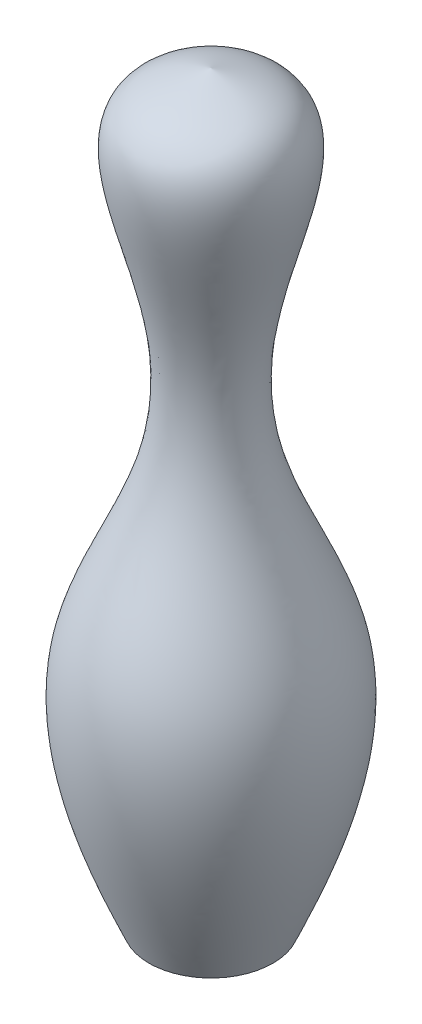
ISO-10303-21;
HEADER;
FILE_DESCRIPTION(('STEP AP214'),'2;1');
FILE_NAME('part.step','',(''),(''),'','','');
FILE_SCHEMA(('AUTOMOTIVE_DESIGN { 1 0 10303 214 1 1 1 1 }'));
ENDSEC;
DATA;
#1=APPLICATION_CONTEXT('core data for automotive mechanical design processes');
#2=APPLICATION_PROTOCOL_DEFINITION('international standard','automotive_design',2000,#1);
#3=PRODUCT_CONTEXT('',#1,'mechanical');
#4=PRODUCT('Part','Part','',(#3));
#5=PRODUCT_RELATED_PRODUCT_CATEGORY('part','',(#4));
#6=PRODUCT_DEFINITION_FORMATION('','',#4);
#7=PRODUCT_DEFINITION_CONTEXT('part definition',#1,'design');
#8=PRODUCT_DEFINITION('design','',#6,#7);
#9=PRODUCT_DEFINITION_SHAPE('','',#8);
#10=(LENGTH_UNIT() NAMED_UNIT(*) SI_UNIT(.MILLI.,.METRE.));
#11=(NAMED_UNIT(*) PLANE_ANGLE_UNIT() SI_UNIT($,.RADIAN.));
#12=(NAMED_UNIT(*) SI_UNIT($,.STERADIAN.) SOLID_ANGLE_UNIT());
#13=UNCERTAINTY_MEASURE_WITH_UNIT(LENGTH_MEASURE(1.E-05),#10,'distance_accuracy_value','');
#14=(GEOMETRIC_REPRESENTATION_CONTEXT(3) GLOBAL_UNCERTAINTY_ASSIGNED_CONTEXT((#13)) GLOBAL_UNIT_ASSIGNED_CONTEXT((#10,
#11,#12)) REPRESENTATION_CONTEXT('',''));
#15=CARTESIAN_POINT('',(0.,0.,0.));
#16=DIRECTION('',(0.,0.,1.));
#17=DIRECTION('',(1.,0.,0.));
#18=AXIS2_PLACEMENT_3D('',#15,#16,#17);
#19=CARTESIAN_POINT('',(0.,0.,0.));
#20=DIRECTION('',(0.,1.,0.));
#21=DIRECTION('',(0.,0.,1.));
#22=AXIS2_PLACEMENT_3D('',#19,#20,#21);
#23=PLANE('',#22);
#24=CARTESIAN_POINT('',(0.,0.,0.));
#25=DIRECTION('',(0.,1.,0.));
#26=DIRECTION('',(0.,0.,1.));
#27=AXIS2_PLACEMENT_3D('',#24,#25,#26);
#28=CIRCLE('',#27,31.75);
#29=CARTESIAN_POINT('',(0.,0.,31.75));
#30=VERTEX_POINT('',#29);
#31=EDGE_CURVE('E12',#30,#30,#28,.T.);
#32=ORIENTED_EDGE('',*,*,#31,.F.);
#33=EDGE_LOOP('',(#32));
#34=FACE_BOUND('',#33,.T.);
#35=ADVANCED_FACE('F78',(#34),#23,.F.);
#36=CARTESIAN_POINT('',(3.16663542822949,0.,31.5916906806945));
#37=CARTESIAN_POINT('',(9.499769656982,42.9725274749654,49.9112858692772));
#38=CARTESIAN_POINT('',(19.2342785375199,132.2861154209,79.310308211931));
#39=CARTESIAN_POINT('',(-22.3027870591613,237.017821482715,-12.1181370112404));
#40=CARTESIAN_POINT('',(7.87553133322772,363.116845883692,65.4313444200855));
#41=CARTESIAN_POINT('',(1.46471732391017,377.67403194375,12.1691375024412));
#42=CARTESIAN_POINT('',(0.,381.,0.));
#43=CARTESIAN_POINT('',(5.23430662300992,0.,31.3844348891163));
#44=CARTESIAN_POINT('',(12.7664717244933,42.9725290000868,49.2895386438164));
#45=CARTESIAN_POINT('',(24.4251179301998,132.286114686026,78.0514223016016));
#46=CARTESIAN_POINT('',(-23.0959153492308,237.01782165872,-10.6584218066882));
#47=CARTESIAN_POINT('',(12.1580024459148,363.11684587373,64.9158920576719));
#48=CARTESIAN_POINT('',(2.26118544301125,377.674031941897,12.0732719699542));
#49=CARTESIAN_POINT('',(0.,381.,0.));
#50=CARTESIAN_POINT('',(9.32877665451283,0.,30.5627585130787));
#51=CARTESIAN_POINT('',(19.1773080510315,42.9725748475129,47.4029210954109));
#52=CARTESIAN_POINT('',(34.5588287267523,132.286092594605,74.5120219898257));
#53=CARTESIAN_POINT('',(-24.3947382156472,237.017826949692,-7.58491738639315));
#54=CARTESIAN_POINT('',(20.621320492197,363.116845574249,63.0418048039179));
#55=CARTESIAN_POINT('',(3.83522128080285,377.674031886199,11.7247230338956));
#56=CARTESIAN_POINT('',(0.,381.,0.));
#57=CARTESIAN_POINT('',(15.1120324711538,0.,28.155462156039));
#58=CARTESIAN_POINT('',(28.0566295643723,42.9724692718067,42.7501575139924));
#59=CARTESIAN_POINT('',(48.4311865893113,132.286143465887,66.3366163325763));
#60=CARTESIAN_POINT('',(-25.4051912104954,237.017814765845,-2.6746148175494));
#61=CARTESIAN_POINT('',(32.5239168152912,363.116846263884,57.8069700966195));
#62=CARTESIAN_POINT('',(6.0489054496906,377.674032014459,10.7511311885764));
#63=CARTESIAN_POINT('',(0.,381.,0.));
#64=CARTESIAN_POINT('',(20.314514289368,0.,24.6662908521901));
#65=CARTESIAN_POINT('',(35.8577806122383,42.9726022190068,36.4558989965607));
#66=CARTESIAN_POINT('',(60.4425680764867,132.286079405747,55.6155313175213));
#67=CARTESIAN_POINT('',(-25.4401079303351,237.017830108468,2.32566857633943));
#68=CARTESIAN_POINT('',(43.1766258921574,363.116845395454,50.3516242522325));
#69=CARTESIAN_POINT('',(8.03013146115085,377.674031852946,9.36456134941616));
#70=CARTESIAN_POINT('',(0.,381.,0.));
#71=CARTESIAN_POINT('',(24.7363643778042,0.,20.2291323307413));
#72=CARTESIAN_POINT('',(42.2807604634572,42.9724602906549,28.7591418920904));
#73=CARTESIAN_POINT('',(70.1305610270316,132.286147793423,42.7530849447898));
#74=CARTESIAN_POINT('',(-24.4950311981438,237.017813729385,7.25197740091281));
#75=CARTESIAN_POINT('',(52.1700379600744,363.116846322549,40.9602671532404));
#76=CARTESIAN_POINT('',(9.70275593556101,377.67403202537,7.61792574403373));
#77=CARTESIAN_POINT('',(0.,381.,0.));
#78=CARTESIAN_POINT('',(28.2075539471341,0.,15.0146136334595));
#79=CARTESIAN_POINT('',(47.0793397796464,42.9726054410351,19.9585948734876));
#80=CARTESIAN_POINT('',(77.124789862623,132.286077853225,28.2515002192304));
#81=CARTESIAN_POINT('',(-22.613688180624,237.017830480303,11.8848340906145));
#82=CARTESIAN_POINT('',(59.1587568920692,363.116845374408,29.9957355476188));
#83=CARTESIAN_POINT('',(11.0025409606606,377.674031849032,5.57870594897612));
#84=CARTESIAN_POINT('',(0.,381.,0.));
#85=CARTESIAN_POINT('',(30.5947611005031,0.,9.22310265688981));
#86=CARTESIAN_POINT('',(50.0679669658674,42.9724572053196,10.3899050247971));
#87=CARTESIAN_POINT('',(81.1530770544967,132.286149280081,12.6610595325141));
#88=CARTESIAN_POINT('',(-19.8551551100166,237.017813373325,16.0732173899268));
#89=CARTESIAN_POINT('',(63.8736132388557,363.116846342704,17.8778133104092));
#90=CARTESIAN_POINT('',(11.8794255134207,377.674032029118,3.32497475553259));
#91=CARTESIAN_POINT('',(0.,381.,0.));
#92=CARTESIAN_POINT('',(31.8062263343079,0.,3.07715055155656));
#93=CARTESIAN_POINT('',(51.1334547791807,42.9725999092899,0.422888530619587));
#94=CARTESIAN_POINT('',(82.0653749460862,132.286080518677,-3.4133242457459));
#95=CARTESIAN_POINT('',(-16.3441350752457,237.017829841918,19.6336945905085));
#96=CARTESIAN_POINT('',(66.1344338405991,363.11684541054,5.0734302436492));
#97=CARTESIAN_POINT('',(12.2999003946081,377.674031855752,0.943573310180353));
#98=CARTESIAN_POINT('',(0.,381.,0.));
#99=CARTESIAN_POINT('',(31.7954030659141,0.,-3.18705539017314));
#100=CARTESIAN_POINT('',(50.2328174265365,42.9724606764993,-9.56117657637162));
#101=CARTESIAN_POINT('',(79.8208518623855,132.286147607504,-19.3587109130613));
#102=CARTESIAN_POINT('',(-12.1928373513285,237.017813773912,22.4481981454884));
#103=CARTESIAN_POINT('',(65.8530699411314,363.116846320031,-7.92640658045472));
#104=CARTESIAN_POINT('',(12.2475714074661,377.674032024902,-1.47417927038954));
#105=CARTESIAN_POINT('',(0.,381.,0.));
#106=CARTESIAN_POINT('',(30.5627012371186,0.,-9.3287821541252));
#107=CARTESIAN_POINT('',(47.4029860197441,42.9726029839626,-19.1772359962067));
#108=CARTESIAN_POINT('',(74.5122954868169,132.286079037157,-34.5586036021061));
#109=CARTESIAN_POINT('',(-7.5865370918008,237.017830196748,24.3939115453153));
#110=CARTESIAN_POINT('',(63.0417790560397,363.116845390454,-20.6212847525157));
#111=CARTESIAN_POINT('',(11.7247182452202,377.674031852016,-3.83521463381891));
#112=CARTESIAN_POINT('',(0.,381.,0.));
#113=CARTESIAN_POINT('',(28.1554974802465,0.,-15.1120156876312));
#114=CARTESIAN_POINT('',(42.7501694311277,42.9724563342642,-28.0566201304165));
#115=CARTESIAN_POINT('',(66.3365859340493,132.286149699796,-48.4311895430072));
#116=CARTESIAN_POINT('',(-2.67414885317778,237.0178132728,25.4052307164498));
#117=CARTESIAN_POINT('',(57.8070161953866,363.116846348398,-32.5238847845132));
#118=CARTESIAN_POINT('',(10.7511397621774,377.674032030177,-6.04889949250073));
#119=CARTESIAN_POINT('',(0.,381.,0.));
#120=CARTESIAN_POINT('',(24.6662947322314,0.,-20.314490778563));
#121=CARTESIAN_POINT('',(36.4558418916855,42.9725991115653,-35.8577739368315));
#122=CARTESIAN_POINT('',(55.6153759762746,132.286080903057,-60.4425782362194));
#123=CARTESIAN_POINT('',(2.32609613529755,237.01782974986,25.4401247039657));
#124=CARTESIAN_POINT('',(50.3516080955759,363.116845415747,-43.1765786633766));
#125=CARTESIAN_POINT('',(9.36455834454781,377.67403185672,-8.03012267738624));
#126=CARTESIAN_POINT('',(0.,381.,0.));
#127=CARTESIAN_POINT('',(20.2291898777345,0.,-24.7363228662634));
#128=CARTESIAN_POINT('',(28.7592158728373,42.9724573921185,-42.2807161495646));
#129=CARTESIAN_POINT('',(42.7532086191489,132.286149190073,-70.1304945144048));
#130=CARTESIAN_POINT('',(7.25153577450197,237.01781339488,24.4947528212506));
#131=CARTESIAN_POINT('',(40.9604102724955,363.116846341488,-52.1699373338929));
#132=CARTESIAN_POINT('',(7.6179523618254,377.674032028892,-9.70273722077148));
#133=CARTESIAN_POINT('',(0.,381.,0.));
#134=CARTESIAN_POINT('',(15.0146387053751,0.,-28.2075402501515));
#135=CARTESIAN_POINT('',(19.958623638812,42.9726016707888,-47.079327532915));
#136=CARTESIAN_POINT('',(28.2515498985355,132.286079669904,-77.1247705985735));
#137=CARTESIAN_POINT('',(11.8845537261466,237.017830045204,22.6135484297372));
#138=CARTESIAN_POINT('',(29.9958028631066,363.11684539903,-59.1587210021704));
#139=CARTESIAN_POINT('',(5.57871846853282,377.674031853611,-11.0025342857387));
#140=CARTESIAN_POINT('',(0.,381.,0.));
#141=CARTESIAN_POINT('',(9.22311868651746,0.,-30.594757422441));
#142=CARTESIAN_POINT('',(10.3899145745958,42.9724575451638,-50.0679548326004));
#143=CARTESIAN_POINT('',(12.6610588310913,132.286149116329,-81.1530544805726));
#144=CARTESIAN_POINT('',(16.0733185913824,237.017813412542,19.8551799215962));
#145=CARTESIAN_POINT('',(17.8778404544046,363.116846340488,-63.8736071657805));
#146=CARTESIAN_POINT('',(3.3249798038625,377.674032028706,-11.8794243839302));
#147=CARTESIAN_POINT('',(0.,381.,0.));
#148=CARTESIAN_POINT('',(3.07715074093568,0.,-31.8062281333994));
#149=CARTESIAN_POINT('',(0.422880337147884,42.97259910039,-51.1334559954618));
#150=CARTESIAN_POINT('',(-3.41334780321522,132.286080908442,-82.0653726925786));
#151=CARTESIAN_POINT('',(19.633799149622,237.017829748568,16.3440690783149));
#152=CARTESIAN_POINT('',(5.07342470657952,363.116845415823,-66.1344337935713));
#153=CARTESIAN_POINT('',(0.943572280377849,377.674031856734,-12.2999003858617));
#154=CARTESIAN_POINT('',(0.,381.,0.));
#155=CARTESIAN_POINT('',(-3.18705454682676,0.,-31.7954004203592));
#156=CARTESIAN_POINT('',(-9.56117236583509,42.9724548901645,-50.2327917800436));
#157=CARTESIAN_POINT('',(-19.3587002565667,132.286150395631,-79.8207861928388));
#158=CARTESIAN_POINT('',(22.4481710933334,237.017813106145,12.1926305993962));
#159=CARTESIAN_POINT('',(-7.92640331029289,363.11684635783,-65.8530528187577));
#160=CARTESIAN_POINT('',(-1.47417866219404,377.674032031932,-12.2475682229905));
#161=CARTESIAN_POINT('',(0.,381.,0.));
#162=CARTESIAN_POINT('',(-9.32878405219214,0.,-30.5627026433175));
#163=CARTESIAN_POINT('',(-19.1772438078843,42.972601271612,-47.4029829618614));
#164=CARTESIAN_POINT('',(-34.5586201075212,132.286079862246,-74.5122825316086));
#165=CARTESIAN_POINT('',(24.3939343915958,237.017829999137,7.58643938300653));
#166=CARTESIAN_POINT('',(-20.6212899418259,363.116845401638,-63.0417764006097));
#167=CARTESIAN_POINT('',(-3.83521559894395,377.674031854096,-11.7247177513546));
#168=CARTESIAN_POINT('',(0.,381.,0.));
#169=CARTESIAN_POINT('',(-15.1120285597858,0.,-28.1554913445285));
#170=CARTESIAN_POINT('',(-28.0566417001252,42.9724596563637,-42.7501535285002));
#171=CARTESIAN_POINT('',(-48.4312304706175,132.286148099054,-66.3365575685267));
#172=CARTESIAN_POINT('',(25.4053573758854,237.017813656183,2.6741724681841));
#173=CARTESIAN_POINT('',(-32.5239183158099,363.116846326698,-57.8070049051285));
#174=CARTESIAN_POINT('',(-6.04890572876202,377.674032026142,-10.7511376623779));
#175=CARTESIAN_POINT('',(0.,381.,0.));
#176=CARTESIAN_POINT('',(-20.3145164013383,0.,-24.6662750693456));
#177=CARTESIAN_POINT('',(-35.8577976106979,42.9726030596558,-36.4558420604055));
#178=CARTESIAN_POINT('',(-60.4426107483898,132.286079000683,-55.6153998385897));
#179=CARTESIAN_POINT('',(25.4402798116641,237.017830205485,-2.32607730003092));
#180=CARTESIAN_POINT('',(-43.1766398892832,363.116845389958,-50.3515687570828));
#181=CARTESIAN_POINT('',(-8.03013406438252,377.674031851924,-9.36455102824497));
#182=CARTESIAN_POINT('',(0.,381.,0.));
#183=CARTESIAN_POINT('',(-24.7363633151269,0.,-20.2291404166246));
#184=CARTESIAN_POINT('',(-42.2807479370641,42.9724603186085,-28.7591847440629));
#185=CARTESIAN_POINT('',(-70.1305281707376,132.286147779954,-42.7531897616577));
#186=CARTESIAN_POINT('',(24.4948997960566,237.01781373261,-7.25162478403096));
#187=CARTESIAN_POINT('',(-52.1700283753125,363.116846322371,-40.9603036910679));
#188=CARTESIAN_POINT('',(-9.70275415295533,377.674032025337,-7.61793253945955));
#189=CARTESIAN_POINT('',(0.,381.,0.));
#190=CARTESIAN_POINT('',(-28.207554436279,0.,-15.0146096896986));
#191=CARTESIAN_POINT('',(-47.0793349712784,42.9726033504759,-19.9586020149508));
#192=CARTESIAN_POINT('',(-77.1247753277133,132.286078860552,-28.2515273348843));
#193=CARTESIAN_POINT('',(22.6136319530234,237.017830239046,-11.884692361395));
#194=CARTESIAN_POINT('',(-59.1587546968699,363.116845388059,-29.9957354839178));
#195=CARTESIAN_POINT('',(-11.0025405523902,377.67403185157,-5.57870593712878));
#196=CARTESIAN_POINT('',(0.,381.,0.));
#197=CARTESIAN_POINT('',(-30.5947608812443,0.,-9.22310485264347));
#198=CARTESIAN_POINT('',(-50.0679750566635,42.9724602039652,-10.3898879381785));
#199=CARTESIAN_POINT('',(-81.1531004041202,132.286147835195,-12.661007846992));
#200=CARTESIAN_POINT('',(19.8552461595518,237.017813719378,-16.0734414250012));
#201=CARTESIAN_POINT('',(-63.8736179515329,363.116846323121,-17.8778051312234));
#202=CARTESIAN_POINT('',(-11.8794263899,377.674032025476,-3.32497323434062));
#203=CARTESIAN_POINT('',(0.,381.,0.));
#204=CARTESIAN_POINT('',(-31.806226378451,0.,-3.07714915973047));
#205=CARTESIAN_POINT('',(-51.1334557220115,42.9726011801581,-0.422882311177007));
#206=CARTESIAN_POINT('',(-82.0653777171122,132.286079906313,3.41333915744511));
#207=CARTESIAN_POINT('',(16.34414705319,237.017829988583,-19.6337405920405));
#208=CARTESIAN_POINT('',(-66.1344346036894,363.116845402235,-5.0734247866641));
#209=CARTESIAN_POINT('',(-12.2999005365302,377.674031854207,-0.943572295272243));
#210=CARTESIAN_POINT('',(0.,381.,0.));
#211=CARTESIAN_POINT('',(-31.7954031806674,0.,3.18705424534416));
#212=CARTESIAN_POINT('',(-50.2328104957368,42.9724559787193,9.56115769645686));
#213=CARTESIAN_POINT('',(-79.8208316831301,132.286149871113,19.3586599215421));
#214=CARTESIAN_POINT('',(12.1927561580754,237.01781323177,-22.4480076267459));
#215=CARTESIAN_POINT('',(-65.8530655850342,363.11684635072,7.92639345034235));
#216=CARTESIAN_POINT('',(-12.2475705973047,377.674032030609,1.47417682840788));
#217=CARTESIAN_POINT('',(0.,381.,0.));
#218=CARTESIAN_POINT('',(-30.5627009176064,0.,9.32878350949959));
#219=CARTESIAN_POINT('',(-47.4029875326283,42.9726039716853,19.1772417288756));
#220=CARTESIAN_POINT('',(-74.5123005304538,132.286078561226,34.5586171029068));
#221=CARTESIAN_POINT('',(7.58656024930479,237.017830310735,-24.3939524529386));
#222=CARTESIAN_POINT('',(-63.04177970663,363.116845384003,20.6212898450477));
#223=CARTESIAN_POINT('',(-11.7247183662191,377.674031850816,3.83521558094483));
#224=CARTESIAN_POINT('',(0.,381.,0.));
#225=CARTESIAN_POINT('',(-28.1554981309528,0.,15.1120135790799));
#226=CARTESIAN_POINT('',(-42.7501797591803,42.9724632328853,28.0566365524136));
#227=CARTESIAN_POINT('',(-66.3366138307831,132.286146375719,48.4312404221152));
#228=CARTESIAN_POINT('',(2.67425264455096,237.017814068928,-25.4054499387929));
#229=CARTESIAN_POINT('',(-57.8070234122304,363.116846303335,32.5238928733972));
#230=CARTESIAN_POINT('',(-10.7511411043898,377.674032021797,6.04890099689809));
#231=CARTESIAN_POINT('',(0.,381.,0.));
#232=CARTESIAN_POINT('',(-24.6662934700665,0.,20.3144945467789));
#233=CARTESIAN_POINT('',(-36.4558336842344,42.9725947815299,35.8577672223401));
#234=CARTESIAN_POINT('',(-55.6153552800607,132.28608298947,60.4425517415924));
#235=CARTESIAN_POINT('',(-2.32616656617031,237.017829250156,-25.4399877956442));
#236=CARTESIAN_POINT('',(-50.3516015072215,363.116845444032,43.1765786333484));
#237=CARTESIAN_POINT('',(-9.36455711922391,377.674031861981,8.03012267180149));
#238=CARTESIAN_POINT('',(0.,381.,0.));
#239=CARTESIAN_POINT('',(-20.2291925241439,0.,24.7363151521655));
#240=CARTESIAN_POINT('',(-28.7592053471728,42.972446173752,42.2806755717235));
#241=CARTESIAN_POINT('',(-42.7531744867345,132.286154595602,70.1303934917438));
#242=CARTESIAN_POINT('',(-7.25169050081731,237.017812100238,-24.4944127692622));
#243=CARTESIAN_POINT('',(-40.9604069690913,363.116846414767,52.1699022836988));
#244=CARTESIAN_POINT('',(-7.61795174744738,377.674032042521,9.70273070202066));
#245=CARTESIAN_POINT('',(0.,381.,0.));
#246=CARTESIAN_POINT('',(-15.0146335028667,0.,28.2075552998195));
#247=CARTESIAN_POINT('',(-19.9586310005241,42.9726156982233,47.0793832843173));
#248=CARTESIAN_POINT('',(-28.2515807981392,132.286072910836,77.1249009601531));
#249=CARTESIAN_POINT('',(-11.8843963064899,237.017831664023,-22.6139584959094));
#250=CARTESIAN_POINT('',(-29.9958010510435,363.116845307402,59.1587750421571));
#251=CARTESIAN_POINT('',(-5.57871813151935,377.67403183657,11.0025443362739));
#252=CARTESIAN_POINT('',(0.,381.,0.));
#253=CARTESIAN_POINT('',(-9.2231283133574,0.,30.5947295909718));
#254=CARTESIAN_POINT('',(-10.3899520162449,42.9724652714756,50.0679556155455));
#255=CARTESIAN_POINT('',(-12.661137942343,132.286145393432,81.1531108955548));
#256=CARTESIAN_POINT('',(-16.073070307828,237.01781430419,-19.8555962463722));
#257=CARTESIAN_POINT('',(-17.8778743488321,363.116846290017,63.8735737181864));
#258=CARTESIAN_POINT('',(-3.32498610766004,377.67403201932,11.8794181632361));
#259=CARTESIAN_POINT('',(0.,381.,0.));
#260=CARTESIAN_POINT('',(-3.07713240148484,0.,31.8062814233649));
#261=CARTESIAN_POINT('',(-0.422786241351074,42.9725656967841,51.1333926089927));
#262=CARTESIAN_POINT('',(3.41354591333519,132.286097003852,82.0650773744873));
#263=CARTESIAN_POINT('',(-19.6344379320465,237.017825893662,-16.3424566637028));
#264=CARTESIAN_POINT('',(-5.07335075115875,363.116845634021,66.1344516913968));
#265=CARTESIAN_POINT('',(-0.943558525904477,377.674031897315,12.2999037145584));
#266=CARTESIAN_POINT('',(0.,381.,0.));
#267=CARTESIAN_POINT('',(1.09896423344907,0.,31.7989464722727));
#268=CARTESIAN_POINT('',(6.23306758947075,42.9725259498439,50.5330330947381));
#269=CARTESIAN_POINT('',(14.04343914484,132.286116155774,80.5691941222604));
#270=CARTESIAN_POINT('',(-21.5096587690918,237.017821306711,-13.5778522157926));
#271=CARTESIAN_POINT('',(3.59306022054068,363.116845893655,65.9467967824992));
#272=CARTESIAN_POINT('',(0.66824920480908,377.674031945603,12.2650030349282));
#273=CARTESIAN_POINT('',(0.,381.,0.));
#274=CARTESIAN_POINT('',(3.16663542822949,0.,31.5916906806945));
#275=CARTESIAN_POINT('',(9.499769656982,42.9725274749654,49.9112858692772));
#276=CARTESIAN_POINT('',(19.2342785375199,132.2861154209,79.310308211931));
#277=CARTESIAN_POINT('',(-22.3027870591613,237.017821482715,-12.1181370112404));
#278=CARTESIAN_POINT('',(7.87553133322772,363.116845883692,65.4313444200855));
#279=CARTESIAN_POINT('',(1.46471732391017,377.67403194375,12.1691375024412));
#280=CARTESIAN_POINT('',(0.,381.,0.));
#281=B_SPLINE_SURFACE_WITH_KNOTS('',3,3,((#36,#37,#38,#39,#40,#41,#42),(#43,#44,#45,#46,#47,#48,
#49),(#50,#51,#52,#53,#54,#55,#56),(#57,#58,#59,#60,#61,#62,#63),(#64,#65,#66,#67,#68,#69,#70),
(#71,#72,#73,#74,#75,#76,#77),(#78,#79,#80,#81,#82,#83,#84),(#85,#86,#87,#88,#89,#90,#91),(#92,
#93,#94,#95,#96,#97,#98),(#99,#100,#101,#102,#103,#104,#105),(#106,#107,#108,#109,#110,#111,
#112),(#113,#114,#115,#116,#117,#118,#119),(#120,#121,#122,#123,#124,#125,#126),(#127,#128,#129,
#130,#131,#132,#133),(#134,#135,#136,#137,#138,#139,#140),(#141,#142,#143,#144,#145,#146,#147),
(#148,#149,#150,#151,#152,#153,#154),(#155,#156,#157,#158,#159,#160,#161),(#162,#163,#164,#165,
#166,#167,#168),(#169,#170,#171,#172,#173,#174,#175),(#176,#177,#178,#179,#180,#181,#182),(#183,
#184,#185,#186,#187,#188,#189),(#190,#191,#192,#193,#194,#195,#196),(#197,#198,#199,#200,#201,
#202,#203),(#204,#205,#206,#207,#208,#209,#210),(#211,#212,#213,#214,#215,#216,#217),(#218,#219,
#220,#221,#222,#223,#224),(#225,#226,#227,#228,#229,#230,#231),(#232,#233,#234,#235,#236,#237,
#238),(#239,#240,#241,#242,#243,#244,#245),(#246,#247,#248,#249,#250,#251,#252),(#253,#254,#255,
#256,#257,#258,#259),(#260,#261,#262,#263,#264,#265,#266),(#267,#268,#269,#270,#271,#272,#273),
(#274,#275,#276,#277,#278,#279,#280)),.UNSPECIFIED.,.T.,.F.,.F.,(4,1,1,1,1,1,1,1,1,1,1,1,1,1,1,
1,1,1,1,1,1,1,1,1,1,1,1,1,1,1,1,1,4),(4,1,1,1,4),(0.,0.03125,0.0625,0.09375,0.125,0.15625,
0.1875,0.21875,0.25,0.28125,0.3125,0.34375,0.375,0.40625,0.4375,0.46875,0.5,0.53125,0.5625,
0.59375,0.625,0.65625,0.6875,0.71875,0.75,0.78125,0.8125,0.84375,0.875,0.90625,0.9375,0.96875,
1.),(0.,0.314067873376176,0.637158563150792,0.917099429555582,1.),.UNSPECIFIED.);
#282=CARTESIAN_POINT('',(0.,381.,0.));
#283=VERTEX_POINT('',#282);
#284=VERTEX_LOOP('',#283);
#285=FACE_BOUND('',#284,.T.);
#286=ORIENTED_EDGE('',*,*,#31,.T.);
#287=EDGE_LOOP('',(#286));
#288=FACE_BOUND('',#287,.T.);
#289=ADVANCED_FACE('F80',(#285,#288),#281,.T.);
#290=CLOSED_SHELL('',(#35,#289));
#291=MANIFOLD_SOLID_BREP('B2',#290);
#292=ADVANCED_BREP_SHAPE_REPRESENTATION('',(#18,#291),#14);
#293=SHAPE_DEFINITION_REPRESENTATION(#9,#292);
ENDSEC;
END-ISO-10303-21;
